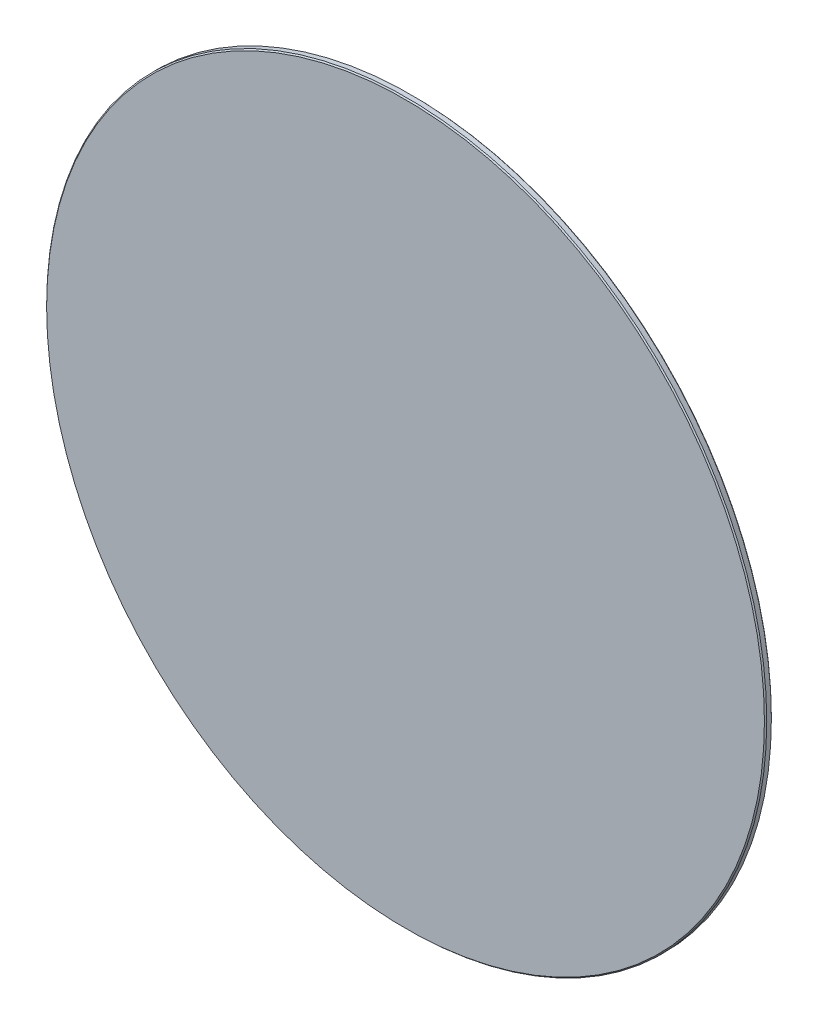
ISO-10303-21;
HEADER;
FILE_DESCRIPTION(('STEP AP214'),'2;1');
FILE_NAME('part.step','',(''),(''),'','','');
FILE_SCHEMA(('AUTOMOTIVE_DESIGN { 1 0 10303 214 1 1 1 1 }'));
ENDSEC;
DATA;
#1=APPLICATION_CONTEXT('core data for automotive mechanical design processes');
#2=APPLICATION_PROTOCOL_DEFINITION('international standard','automotive_design',2000,#1);
#3=PRODUCT_CONTEXT('',#1,'mechanical');
#4=PRODUCT('Part','Part','',(#3));
#5=PRODUCT_RELATED_PRODUCT_CATEGORY('part','',(#4));
#6=PRODUCT_DEFINITION_FORMATION('','',#4);
#7=PRODUCT_DEFINITION_CONTEXT('part definition',#1,'design');
#8=PRODUCT_DEFINITION('design','',#6,#7);
#9=PRODUCT_DEFINITION_SHAPE('','',#8);
#10=(LENGTH_UNIT() NAMED_UNIT(*) SI_UNIT(.MILLI.,.METRE.));
#11=(NAMED_UNIT(*) PLANE_ANGLE_UNIT() SI_UNIT($,.RADIAN.));
#12=(NAMED_UNIT(*) SI_UNIT($,.STERADIAN.) SOLID_ANGLE_UNIT());
#13=UNCERTAINTY_MEASURE_WITH_UNIT(LENGTH_MEASURE(1.E-05),#10,'distance_accuracy_value','');
#14=(GEOMETRIC_REPRESENTATION_CONTEXT(3) GLOBAL_UNCERTAINTY_ASSIGNED_CONTEXT((#13)) GLOBAL_UNIT_ASSIGNED_CONTEXT((#10,
#11,#12)) REPRESENTATION_CONTEXT('',''));
#15=CARTESIAN_POINT('',(0.,0.,0.));
#16=DIRECTION('',(0.,0.,1.));
#17=DIRECTION('',(1.,0.,0.));
#18=AXIS2_PLACEMENT_3D('',#15,#16,#17);
#19=CARTESIAN_POINT('',(0.,0.,3.));
#20=DIRECTION('',(0.,0.,-1.));
#21=DIRECTION('',(-1.,0.,0.));
#22=AXIS2_PLACEMENT_3D('',#19,#20,#21);
#23=CYLINDRICAL_SURFACE('',#22,155.);
#24=CARTESIAN_POINT('',(0.,0.,0.499999999999973));
#25=DIRECTION('',(0.,0.,1.));
#26=DIRECTION('',(1.,0.,0.));
#27=AXIS2_PLACEMENT_3D('',#24,#25,#26);
#28=CIRCLE('',#27,155.);
#29=CARTESIAN_POINT('',(155.,0.,0.499999999999973));
#30=VERTEX_POINT('',#29);
#31=EDGE_CURVE('E66',#30,#30,#28,.T.);
#32=ORIENTED_EDGE('',*,*,#31,.T.);
#33=EDGE_LOOP('',(#32));
#34=FACE_BOUND('',#33,.T.);
#35=CARTESIAN_POINT('',(0.,0.,2.5));
#36=DIRECTION('',(0.,0.,1.));
#37=DIRECTION('',(1.,0.,0.));
#38=AXIS2_PLACEMENT_3D('',#35,#36,#37);
#39=CIRCLE('',#38,155.);
#40=CARTESIAN_POINT('',(155.,0.,2.5));
#41=VERTEX_POINT('',#40);
#42=EDGE_CURVE('E71',#41,#41,#39,.F.);
#43=ORIENTED_EDGE('',*,*,#42,.T.);
#44=EDGE_LOOP('',(#43));
#45=FACE_BOUND('',#44,.T.);
#46=ADVANCED_FACE('F52',(#34,#45),#23,.T.);
#47=CARTESIAN_POINT('',(0.,0.,3.));
#48=DIRECTION('',(0.,0.,1.));
#49=DIRECTION('',(1.,0.,0.));
#50=AXIS2_PLACEMENT_3D('',#47,#48,#49);
#51=PLANE('',#50);
#52=CARTESIAN_POINT('',(0.,0.,3.));
#53=DIRECTION('',(0.,0.,1.));
#54=DIRECTION('',(1.,0.,0.));
#55=AXIS2_PLACEMENT_3D('',#52,#53,#54);
#56=CIRCLE('',#55,154.5);
#57=CARTESIAN_POINT('',(154.5,0.,3.));
#58=VERTEX_POINT('',#57);
#59=EDGE_CURVE('E12',#58,#58,#56,.T.);
#60=ORIENTED_EDGE('',*,*,#59,.T.);
#61=EDGE_LOOP('',(#60));
#62=FACE_BOUND('',#61,.T.);
#63=ADVANCED_FACE('F87',(#62),#51,.T.);
#64=CARTESIAN_POINT('',(0.,0.,0.));
#65=DIRECTION('',(0.,0.,1.));
#66=DIRECTION('',(1.,0.,0.));
#67=AXIS2_PLACEMENT_3D('',#64,#65,#66);
#68=PLANE('',#67);
#69=CARTESIAN_POINT('',(0.,0.,0.));
#70=DIRECTION('',(0.,0.,1.));
#71=DIRECTION('',(1.,0.,0.));
#72=AXIS2_PLACEMENT_3D('',#69,#70,#71);
#73=CIRCLE('',#72,154.5);
#74=CARTESIAN_POINT('',(154.5,0.,0.));
#75=VERTEX_POINT('',#74);
#76=EDGE_CURVE('E60',#75,#75,#73,.F.);
#77=ORIENTED_EDGE('',*,*,#76,.T.);
#78=EDGE_LOOP('',(#77));
#79=FACE_BOUND('',#78,.T.);
#80=ADVANCED_FACE('F84',(#79),#68,.F.);
#81=CARTESIAN_POINT('',(0.,0.,0.499999999999973));
#82=DIRECTION('',(0.,0.,1.));
#83=DIRECTION('',(1.,0.,0.));
#84=AXIS2_PLACEMENT_3D('',#81,#82,#83);
#85=CONICAL_SURFACE('',#84,155.,0.785398163397448);
#86=ORIENTED_EDGE('',*,*,#76,.F.);
#87=EDGE_LOOP('',(#86));
#88=FACE_BOUND('',#87,.T.);
#89=ORIENTED_EDGE('',*,*,#31,.F.);
#90=EDGE_LOOP('',(#89));
#91=FACE_BOUND('',#90,.T.);
#92=ADVANCED_FACE('F80',(#88,#91),#85,.T.);
#93=CARTESIAN_POINT('',(0.,0.,3.));
#94=DIRECTION('',(0.,0.,-1.));
#95=DIRECTION('',(-1.,0.,0.));
#96=AXIS2_PLACEMENT_3D('',#93,#94,#95);
#97=CONICAL_SURFACE('',#96,154.5,0.785398163397421);
#98=ORIENTED_EDGE('',*,*,#42,.F.);
#99=EDGE_LOOP('',(#98));
#100=FACE_BOUND('',#99,.T.);
#101=ORIENTED_EDGE('',*,*,#59,.F.);
#102=EDGE_LOOP('',(#101));
#103=FACE_BOUND('',#102,.T.);
#104=ADVANCED_FACE('F54',(#100,#103),#97,.T.);
#105=CLOSED_SHELL('',(#46,#63,#80,#92,#104));
#106=MANIFOLD_SOLID_BREP('B2',#105);
#107=ADVANCED_BREP_SHAPE_REPRESENTATION('',(#18,#106),#14);
#108=SHAPE_DEFINITION_REPRESENTATION(#9,#107);
ENDSEC;
END-ISO-10303-21;
